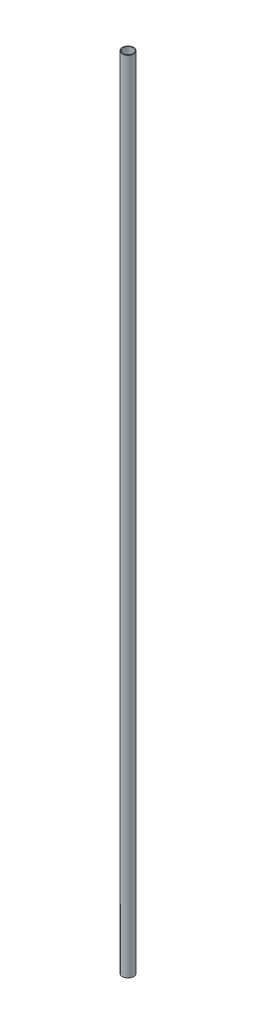
ISO-10303-21;
HEADER;
FILE_DESCRIPTION(('STEP AP214'),'2;1');
FILE_NAME('part.step','',(''),(''),'','','');
FILE_SCHEMA(('AUTOMOTIVE_DESIGN { 1 0 10303 214 1 1 1 1 }'));
ENDSEC;
DATA;
#1=APPLICATION_CONTEXT('core data for automotive mechanical design processes');
#2=APPLICATION_PROTOCOL_DEFINITION('international standard','automotive_design',2000,#1);
#3=PRODUCT_CONTEXT('',#1,'mechanical');
#4=PRODUCT('Part','Part','',(#3));
#5=PRODUCT_RELATED_PRODUCT_CATEGORY('part','',(#4));
#6=PRODUCT_DEFINITION_FORMATION('','',#4);
#7=PRODUCT_DEFINITION_CONTEXT('part definition',#1,'design');
#8=PRODUCT_DEFINITION('design','',#6,#7);
#9=PRODUCT_DEFINITION_SHAPE('','',#8);
#10=(LENGTH_UNIT() NAMED_UNIT(*) SI_UNIT(.MILLI.,.METRE.));
#11=(NAMED_UNIT(*) PLANE_ANGLE_UNIT() SI_UNIT($,.RADIAN.));
#12=(NAMED_UNIT(*) SI_UNIT($,.STERADIAN.) SOLID_ANGLE_UNIT());
#13=UNCERTAINTY_MEASURE_WITH_UNIT(LENGTH_MEASURE(1.E-05),#10,'distance_accuracy_value','');
#14=(GEOMETRIC_REPRESENTATION_CONTEXT(3) GLOBAL_UNCERTAINTY_ASSIGNED_CONTEXT((#13)) GLOBAL_UNIT_ASSIGNED_CONTEXT((#10,
#11,#12)) REPRESENTATION_CONTEXT('',''));
#15=CARTESIAN_POINT('',(0.,0.,0.));
#16=DIRECTION('',(0.,0.,1.));
#17=DIRECTION('',(1.,0.,0.));
#18=AXIS2_PLACEMENT_3D('',#15,#16,#17);
#19=CARTESIAN_POINT('',(0.,1120.,0.));
#20=DIRECTION('',(0.,1.,0.));
#21=DIRECTION('',(0.,0.,1.));
#22=AXIS2_PLACEMENT_3D('',#19,#20,#21);
#23=PLANE('',#22);
#24=CARTESIAN_POINT('',(0.,1120.,0.));
#25=DIRECTION('',(0.,1.,0.));
#26=DIRECTION('',(0.,0.,1.));
#27=AXIS2_PLACEMENT_3D('',#24,#25,#26);
#28=CIRCLE('',#27,8.);
#29=CARTESIAN_POINT('',(0.,1120.,8.));
#30=VERTEX_POINT('',#29);
#31=EDGE_CURVE('E10',#30,#30,#28,.T.);
#32=ORIENTED_EDGE('',*,*,#31,.T.);
#33=EDGE_LOOP('',(#32));
#34=FACE_BOUND('',#33,.T.);
#35=CARTESIAN_POINT('',(0.,1120.,0.));
#36=DIRECTION('',(0.,1.,0.));
#37=DIRECTION('',(0.,0.,1.));
#38=AXIS2_PLACEMENT_3D('',#35,#36,#37);
#39=CIRCLE('',#38,7.);
#40=CARTESIAN_POINT('',(0.,1120.,7.));
#41=VERTEX_POINT('',#40);
#42=EDGE_CURVE('E41',#41,#41,#39,.T.);
#43=ORIENTED_EDGE('',*,*,#42,.F.);
#44=EDGE_LOOP('',(#43));
#45=FACE_BOUND('',#44,.T.);
#46=ADVANCED_FACE('F30',(#34,#45),#23,.T.);
#47=CARTESIAN_POINT('',(0.,0.,0.));
#48=DIRECTION('',(0.,1.,0.));
#49=DIRECTION('',(0.,0.,1.));
#50=AXIS2_PLACEMENT_3D('',#47,#48,#49);
#51=PLANE('',#50);
#52=CARTESIAN_POINT('',(0.,0.,0.));
#53=DIRECTION('',(0.,1.,0.));
#54=DIRECTION('',(0.,0.,1.));
#55=AXIS2_PLACEMENT_3D('',#52,#53,#54);
#56=CIRCLE('',#55,8.);
#57=CARTESIAN_POINT('',(0.,0.,8.));
#58=VERTEX_POINT('',#57);
#59=EDGE_CURVE('E34',#58,#58,#56,.T.);
#60=ORIENTED_EDGE('',*,*,#59,.F.);
#61=EDGE_LOOP('',(#60));
#62=FACE_BOUND('',#61,.T.);
#63=CARTESIAN_POINT('',(0.,0.,0.));
#64=DIRECTION('',(0.,1.,0.));
#65=DIRECTION('',(0.,0.,1.));
#66=AXIS2_PLACEMENT_3D('',#63,#64,#65);
#67=CIRCLE('',#66,7.);
#68=CARTESIAN_POINT('',(0.,0.,7.));
#69=VERTEX_POINT('',#68);
#70=EDGE_CURVE('E43',#69,#69,#67,.T.);
#71=ORIENTED_EDGE('',*,*,#70,.T.);
#72=EDGE_LOOP('',(#71));
#73=FACE_BOUND('',#72,.T.);
#74=ADVANCED_FACE('F53',(#62,#73),#51,.F.);
#75=CARTESIAN_POINT('',(0.,1120.,0.));
#76=DIRECTION('',(0.,-1.,0.));
#77=DIRECTION('',(0.,0.,-1.));
#78=AXIS2_PLACEMENT_3D('',#75,#76,#77);
#79=CYLINDRICAL_SURFACE('',#78,8.);
#80=ORIENTED_EDGE('',*,*,#31,.F.);
#81=EDGE_LOOP('',(#80));
#82=FACE_BOUND('',#81,.T.);
#83=ORIENTED_EDGE('',*,*,#59,.T.);
#84=EDGE_LOOP('',(#83));
#85=FACE_BOUND('',#84,.T.);
#86=ADVANCED_FACE('F32',(#82,#85),#79,.T.);
#87=CARTESIAN_POINT('',(0.,1120.,0.));
#88=DIRECTION('',(0.,-1.,0.));
#89=DIRECTION('',(0.,0.,-1.));
#90=AXIS2_PLACEMENT_3D('',#87,#88,#89);
#91=CYLINDRICAL_SURFACE('',#90,7.);
#92=ORIENTED_EDGE('',*,*,#42,.T.);
#93=EDGE_LOOP('',(#92));
#94=FACE_BOUND('',#93,.T.);
#95=ORIENTED_EDGE('',*,*,#70,.F.);
#96=EDGE_LOOP('',(#95));
#97=FACE_BOUND('',#96,.T.);
#98=ADVANCED_FACE('F49',(#94,#97),#91,.F.);
#99=CLOSED_SHELL('',(#46,#74,#86,#98));
#100=MANIFOLD_SOLID_BREP('B2',#99);
#101=ADVANCED_BREP_SHAPE_REPRESENTATION('',(#18,#100),#14);
#102=SHAPE_DEFINITION_REPRESENTATION(#9,#101);
ENDSEC;
END-ISO-10303-21;
